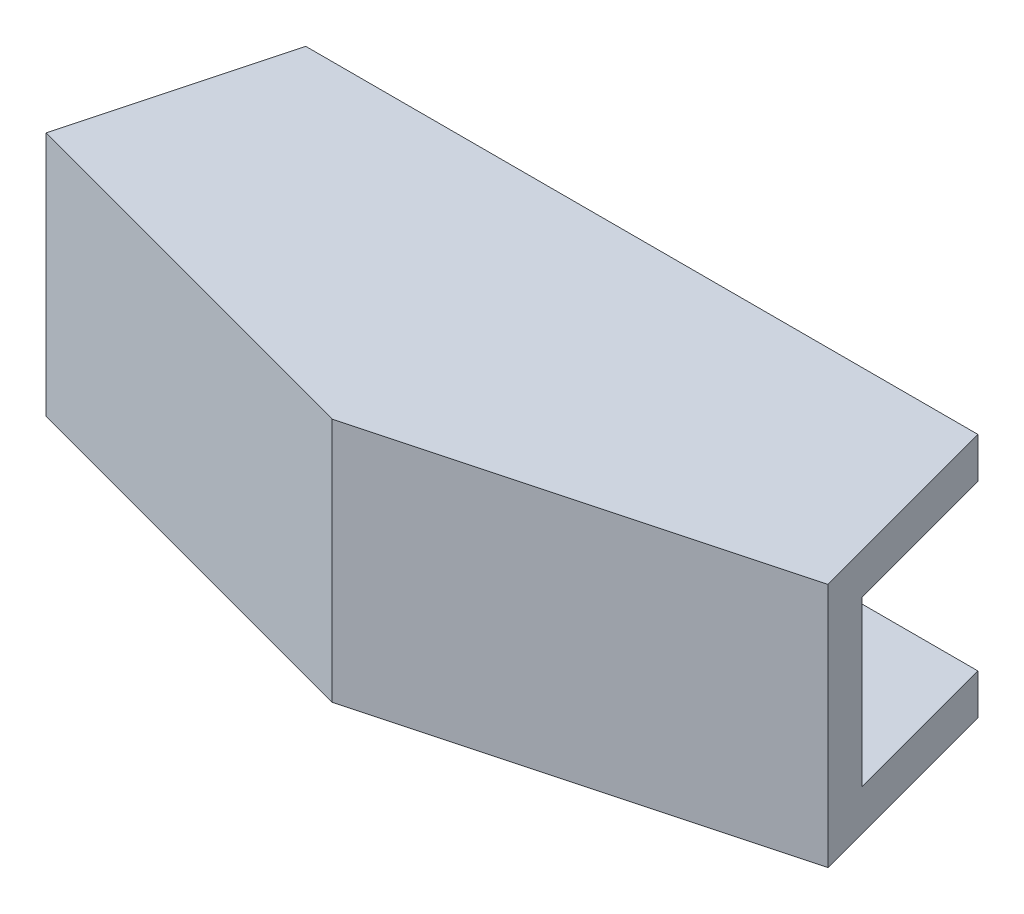
ISO-10303-21;
HEADER;
FILE_DESCRIPTION(('STEP AP214'),'2;1');
FILE_NAME('part.step','',(''),(''),'','','');
FILE_SCHEMA(('AUTOMOTIVE_DESIGN { 1 0 10303 214 1 1 1 1 }'));
ENDSEC;
DATA;
#1=APPLICATION_CONTEXT('core data for automotive mechanical design processes');
#2=APPLICATION_PROTOCOL_DEFINITION('international standard','automotive_design',2000,#1);
#3=PRODUCT_CONTEXT('',#1,'mechanical');
#4=PRODUCT('Part','Part','',(#3));
#5=PRODUCT_RELATED_PRODUCT_CATEGORY('part','',(#4));
#6=PRODUCT_DEFINITION_FORMATION('','',#4);
#7=PRODUCT_DEFINITION_CONTEXT('part definition',#1,'design');
#8=PRODUCT_DEFINITION('design','',#6,#7);
#9=PRODUCT_DEFINITION_SHAPE('','',#8);
#10=(LENGTH_UNIT() NAMED_UNIT(*) SI_UNIT(.MILLI.,.METRE.));
#11=(NAMED_UNIT(*) PLANE_ANGLE_UNIT() SI_UNIT($,.RADIAN.));
#12=(NAMED_UNIT(*) SI_UNIT($,.STERADIAN.) SOLID_ANGLE_UNIT());
#13=UNCERTAINTY_MEASURE_WITH_UNIT(LENGTH_MEASURE(1.E-05),#10,'distance_accuracy_value','');
#14=(GEOMETRIC_REPRESENTATION_CONTEXT(3) GLOBAL_UNCERTAINTY_ASSIGNED_CONTEXT((#13)) GLOBAL_UNIT_ASSIGNED_CONTEXT((#10,
#11,#12)) REPRESENTATION_CONTEXT('',''));
#15=CARTESIAN_POINT('',(0.,0.,0.));
#16=DIRECTION('',(0.,0.,1.));
#17=DIRECTION('',(1.,0.,0.));
#18=AXIS2_PLACEMENT_3D('',#15,#16,#17);
#19=CARTESIAN_POINT('',(-53.4672036631307,5.,37.3612091888934));
#20=DIRECTION('',(0.258819045102508,0.,0.965925826289072));
#21=DIRECTION('',(0.965925826289072,0.,-0.258819045102508));
#22=AXIS2_PLACEMENT_3D('',#19,#20,#21);
#23=PLANE('',#22);
#24=DIRECTION('',(-0.965925826289072,0.,0.258819045102508));
#25=VECTOR('',#24,1.);
#26=CARTESIAN_POINT('',(-11.9506315563798,5.,26.2368772203817));
#27=LINE('',#26,#25);
#28=CARTESIAN_POINT('',(-50.9672036631308,5.,36.6913362078157));
#29=VERTEX_POINT('',#28);
#30=CARTESIAN_POINT('',(-53.4672036631307,5.,37.3612091888934));
#31=VERTEX_POINT('',#30);
#32=EDGE_CURVE('E50',#29,#31,#27,.T.);
#33=ORIENTED_EDGE('',*,*,#32,.T.);
#34=DIRECTION('',(0.,-1.,0.));
#35=VECTOR('',#34,1.);
#36=CARTESIAN_POINT('',(-53.4672036631307,5.,37.3612091888934));
#37=LINE('',#36,#35);
#38=CARTESIAN_POINT('',(-53.4672036631307,25.3,37.3612091888934));
#39=VERTEX_POINT('',#38);
#40=EDGE_CURVE('E238',#39,#31,#37,.T.);
#41=ORIENTED_EDGE('',*,*,#40,.F.);
#42=DIRECTION('',(-0.965925826289072,0.,0.258819045102508));
#43=VECTOR('',#42,1.);
#44=CARTESIAN_POINT('',(-11.9506315563798,25.3,26.2368772203817));
#45=LINE('',#44,#43);
#46=CARTESIAN_POINT('',(-50.9672036631308,25.3,36.6913362078157));
#47=VERTEX_POINT('',#46);
#48=EDGE_CURVE('E166',#47,#39,#45,.T.);
#49=ORIENTED_EDGE('',*,*,#48,.F.);
#50=DIRECTION('',(0.,-1.,0.));
#51=VECTOR('',#50,1.);
#52=CARTESIAN_POINT('',(-50.9672036631308,25.3,36.6913362078157));
#53=LINE('',#52,#51);
#54=EDGE_CURVE('E212',#47,#29,#53,.T.);
#55=ORIENTED_EDGE('',*,*,#54,.T.);
#56=EDGE_LOOP('',(#33,#41,#49,#55));
#57=FACE_BOUND('',#56,.T.);
#58=ADVANCED_FACE('F35',(#57),#23,.F.);
#59=CARTESIAN_POINT('',(-53.4672036631307,5.,37.3612091888934));
#60=DIRECTION('',(-0.258819045102508,0.,0.965925826289072));
#61=DIRECTION('',(0.965925826289072,0.,0.258819045102508));
#62=AXIS2_PLACEMENT_3D('',#59,#60,#61);
#63=PLANE('',#62);
#64=DIRECTION('',(-0.965925826289072,0.,-0.258819045102508));
#65=VECTOR('',#64,1.);
#66=CARTESIAN_POINT('',(-53.4672036631307,5.,37.3612091888934));
#67=LINE('',#66,#65);
#68=CARTESIAN_POINT('',(-55.9672036631307,5.,36.6913362078157));
#69=VERTEX_POINT('',#68);
#70=EDGE_CURVE('E171',#31,#69,#67,.T.);
#71=ORIENTED_EDGE('',*,*,#70,.T.);
#72=DIRECTION('',(0.,-1.,0.));
#73=VECTOR('',#72,1.);
#74=CARTESIAN_POINT('',(-55.9672036631307,25.3,36.6913362078157));
#75=LINE('',#74,#73);
#76=CARTESIAN_POINT('',(-55.9672036631307,25.3,36.6913362078157));
#77=VERTEX_POINT('',#76);
#78=EDGE_CURVE('E209',#77,#69,#75,.T.);
#79=ORIENTED_EDGE('',*,*,#78,.F.);
#80=DIRECTION('',(-0.965925826289072,0.,-0.258819045102508));
#81=VECTOR('',#80,1.);
#82=CARTESIAN_POINT('',(-94.9837757698817,25.3,26.2368772203816));
#83=LINE('',#82,#81);
#84=EDGE_CURVE('E57',#39,#77,#83,.T.);
#85=ORIENTED_EDGE('',*,*,#84,.F.);
#86=ORIENTED_EDGE('',*,*,#40,.T.);
#87=EDGE_LOOP('',(#71,#79,#85,#86));
#88=FACE_BOUND('',#87,.T.);
#89=ADVANCED_FACE('F280',(#88),#63,.F.);
#90=CARTESIAN_POINT('',(0.,5.,0.));
#91=DIRECTION('',(0.,-1.,0.));
#92=DIRECTION('',(0.,0.,-1.));
#93=AXIS2_PLACEMENT_3D('',#90,#91,#92);
#94=PLANE('',#93);
#95=DIRECTION('',(-0.258819045102508,0.,-0.965925826289072));
#96=VECTOR('',#95,1.);
#97=CARTESIAN_POINT('',(-45.7131770475498,5.,56.2996304814838));
#98=LINE('',#97,#96);
#99=CARTESIAN_POINT('',(-45.7131770475498,5.,56.2996304814838));
#100=VERTEX_POINT('',#99);
#101=EDGE_CURVE('E198',#100,#29,#98,.T.);
#102=ORIENTED_EDGE('',*,*,#101,.F.);
#103=DIRECTION('',(-0.965925826289072,0.,0.258819045102508));
#104=VECTOR('',#103,1.);
#105=CARTESIAN_POINT('',(-45.7131770475498,5.,56.2996304814838));
#106=LINE('',#105,#104);
#107=CARTESIAN_POINT('',(-6.69660494079891,5.,45.8451714940498));
#108=VERTEX_POINT('',#107);
#109=EDGE_CURVE('E184',#108,#100,#106,.T.);
#110=ORIENTED_EDGE('',*,*,#109,.F.);
#111=DIRECTION('',(-0.258819045102508,0.,-0.965925826289072));
#112=VECTOR('',#111,1.);
#113=CARTESIAN_POINT('',(-5.17091234867716,5.,51.5391337645799));
#114=LINE('',#113,#112);
#115=CARTESIAN_POINT('',(-11.9506315563798,5.,26.2368772203817));
#116=VERTEX_POINT('',#115);
#117=EDGE_CURVE('E221',#108,#116,#114,.T.);
#118=ORIENTED_EDGE('',*,*,#117,.T.);
#119=DIRECTION('',(1.,0.,0.));
#120=VECTOR('',#119,1.);
#121=CARTESIAN_POINT('',(-94.9837757698817,5.,26.2368772203816));
#122=LINE('',#121,#120);
#123=CARTESIAN_POINT('',(-94.9837757698817,5.,26.2368772203816));
#124=VERTEX_POINT('',#123);
#125=EDGE_CURVE('E259',#124,#116,#122,.T.);
#126=ORIENTED_EDGE('',*,*,#125,.F.);
#127=DIRECTION('',(-0.258819045102508,0.,0.965925826289072));
#128=VECTOR('',#127,1.);
#129=CARTESIAN_POINT('',(-101.763494977584,5.,51.5391337645799));
#130=LINE('',#129,#128);
#131=CARTESIAN_POINT('',(-100.237802385463,5.,45.8451714940498));
#132=VERTEX_POINT('',#131);
#133=EDGE_CURVE('E223',#124,#132,#130,.T.);
#134=ORIENTED_EDGE('',*,*,#133,.T.);
#135=DIRECTION('',(-0.965925826289071,0.,-0.258819045102509));
#136=VECTOR('',#135,1.);
#137=CARTESIAN_POINT('',(-61.2212302787117,5.,56.2996304814838));
#138=LINE('',#137,#136);
#139=CARTESIAN_POINT('',(-61.2212302787117,5.,56.2996304814838));
#140=VERTEX_POINT('',#139);
#141=EDGE_CURVE('E189',#140,#132,#138,.T.);
#142=ORIENTED_EDGE('',*,*,#141,.F.);
#143=DIRECTION('',(-0.258819045102508,0.,0.965925826289072));
#144=VECTOR('',#143,1.);
#145=CARTESIAN_POINT('',(-61.2212302787117,5.,56.2996304814838));
#146=LINE('',#145,#144);
#147=EDGE_CURVE('E200',#69,#140,#146,.T.);
#148=ORIENTED_EDGE('',*,*,#147,.F.);
#149=ORIENTED_EDGE('',*,*,#70,.F.);
#150=ORIENTED_EDGE('',*,*,#32,.F.);
#151=EDGE_LOOP('',(#102,#110,#118,#126,#134,#142,#148,#149,#150));
#152=FACE_BOUND('',#151,.T.);
#153=ADVANCED_FACE('F278',(#152),#94,.F.);
#154=CARTESIAN_POINT('',(-53.4672036631307,5.,64.4800860197053));
#155=DIRECTION('',(0.258819045102508,0.,-0.965925826289072));
#156=DIRECTION('',(-0.965925826289072,0.,-0.258819045102508));
#157=AXIS2_PLACEMENT_3D('',#154,#155,#156);
#158=PLANE('',#157);
#159=DIRECTION('',(0.965925826289072,0.,0.258819045102508));
#160=VECTOR('',#159,1.);
#161=CARTESIAN_POINT('',(-53.4672036631307,0.,64.4800860197053));
#162=LINE('',#161,#160);
#163=CARTESIAN_POINT('',(-101.763494977584,0.,51.5391337645799));
#164=VERTEX_POINT('',#163);
#165=CARTESIAN_POINT('',(-53.4672036631307,0.,64.4800860197053));
#166=VERTEX_POINT('',#165);
#167=EDGE_CURVE('E220',#164,#166,#162,.T.);
#168=ORIENTED_EDGE('',*,*,#167,.T.);
#169=DIRECTION('',(0.,-1.,0.));
#170=VECTOR('',#169,1.);
#171=CARTESIAN_POINT('',(-53.4672036631307,5.,64.4800860197053));
#172=LINE('',#171,#170);
#173=CARTESIAN_POINT('',(-53.4672036631307,30.3,64.4800860197053));
#174=VERTEX_POINT('',#173);
#175=EDGE_CURVE('E11',#174,#166,#172,.T.);
#176=ORIENTED_EDGE('',*,*,#175,.F.);
#177=DIRECTION('',(0.965925826289072,0.,0.258819045102508));
#178=VECTOR('',#177,1.);
#179=CARTESIAN_POINT('',(-101.763494977584,30.3,51.5391337645799));
#180=LINE('',#179,#178);
#181=CARTESIAN_POINT('',(-101.763494977584,30.3,51.5391337645799));
#182=VERTEX_POINT('',#181);
#183=EDGE_CURVE('E161',#182,#174,#180,.T.);
#184=ORIENTED_EDGE('',*,*,#183,.F.);
#185=DIRECTION('',(0.,-1.,0.));
#186=VECTOR('',#185,1.);
#187=CARTESIAN_POINT('',(-101.763494977584,5.,51.5391337645799));
#188=LINE('',#187,#186);
#189=EDGE_CURVE('E226',#182,#164,#188,.T.);
#190=ORIENTED_EDGE('',*,*,#189,.T.);
#191=EDGE_LOOP('',(#168,#176,#184,#190));
#192=FACE_BOUND('',#191,.T.);
#193=ADVANCED_FACE('F37',(#192),#158,.F.);
#194=CARTESIAN_POINT('',(-53.4672036631307,5.,64.4800860197053));
#195=DIRECTION('',(-0.258819045102508,0.,-0.965925826289072));
#196=DIRECTION('',(-0.965925826289072,0.,0.258819045102508));
#197=AXIS2_PLACEMENT_3D('',#194,#195,#196);
#198=PLANE('',#197);
#199=DIRECTION('',(0.965925826289072,0.,-0.258819045102508));
#200=VECTOR('',#199,1.);
#201=CARTESIAN_POINT('',(-53.4672036631307,0.,64.4800860197053));
#202=LINE('',#201,#200);
#203=CARTESIAN_POINT('',(-5.17091234867716,0.,51.5391337645799));
#204=VERTEX_POINT('',#203);
#205=EDGE_CURVE('E229',#166,#204,#202,.T.);
#206=ORIENTED_EDGE('',*,*,#205,.T.);
#207=DIRECTION('',(0.,-1.,0.));
#208=VECTOR('',#207,1.);
#209=CARTESIAN_POINT('',(-5.17091234867716,5.,51.5391337645799));
#210=LINE('',#209,#208);
#211=CARTESIAN_POINT('',(-5.17091234867716,30.3,51.5391337645799));
#212=VERTEX_POINT('',#211);
#213=EDGE_CURVE('E43',#212,#204,#210,.T.);
#214=ORIENTED_EDGE('',*,*,#213,.F.);
#215=DIRECTION('',(0.965925826289072,0.,-0.258819045102508));
#216=VECTOR('',#215,1.);
#217=CARTESIAN_POINT('',(-5.17091234867716,30.3,51.5391337645799));
#218=LINE('',#217,#216);
#219=EDGE_CURVE('E149',#174,#212,#218,.T.);
#220=ORIENTED_EDGE('',*,*,#219,.F.);
#221=ORIENTED_EDGE('',*,*,#175,.T.);
#222=EDGE_LOOP('',(#206,#214,#220,#221));
#223=FACE_BOUND('',#222,.T.);
#224=ADVANCED_FACE('F303',(#223),#198,.F.);
#225=CARTESIAN_POINT('',(-5.17091234867716,5.,51.5391337645799));
#226=DIRECTION('',(-0.965925826289072,0.,0.258819045102508));
#227=DIRECTION('',(0.258819045102508,0.,0.965925826289072));
#228=AXIS2_PLACEMENT_3D('',#225,#226,#227);
#229=PLANE('',#228);
#230=DIRECTION('',(-0.258819045102508,0.,-0.965925826289072));
#231=VECTOR('',#230,1.);
#232=CARTESIAN_POINT('',(-5.17091234867716,0.,51.5391337645799));
#233=LINE('',#232,#231);
#234=CARTESIAN_POINT('',(-11.9506315563798,0.,26.2368772203817));
#235=VERTEX_POINT('',#234);
#236=EDGE_CURVE('E231',#204,#235,#233,.T.);
#237=ORIENTED_EDGE('',*,*,#236,.T.);
#238=DIRECTION('',(0.,-1.,0.));
#239=VECTOR('',#238,1.);
#240=CARTESIAN_POINT('',(-11.9506315563798,5.,26.2368772203817));
#241=LINE('',#240,#239);
#242=EDGE_CURVE('E240',#116,#235,#241,.T.);
#243=ORIENTED_EDGE('',*,*,#242,.F.);
#244=ORIENTED_EDGE('',*,*,#117,.F.);
#245=DIRECTION('',(0.,-1.,0.));
#246=VECTOR('',#245,1.);
#247=CARTESIAN_POINT('',(-6.69660494079891,25.3,45.8451714940498));
#248=LINE('',#247,#246);
#249=CARTESIAN_POINT('',(-6.69660494079891,25.3,45.8451714940498));
#250=VERTEX_POINT('',#249);
#251=EDGE_CURVE('E217',#250,#108,#248,.T.);
#252=ORIENTED_EDGE('',*,*,#251,.F.);
#253=DIRECTION('',(-0.258819045102508,0.,-0.965925826289072));
#254=VECTOR('',#253,1.);
#255=CARTESIAN_POINT('',(-5.17091234867716,25.3,51.5391337645799));
#256=LINE('',#255,#254);
#257=CARTESIAN_POINT('',(-11.9506315563798,25.3,26.2368772203817));
#258=VERTEX_POINT('',#257);
#259=EDGE_CURVE('E150',#250,#258,#256,.T.);
#260=ORIENTED_EDGE('',*,*,#259,.T.);
#261=DIRECTION('',(0.,-1.,0.));
#262=VECTOR('',#261,1.);
#263=CARTESIAN_POINT('',(-11.9506315563798,30.3,26.2368772203817));
#264=LINE('',#263,#262);
#265=CARTESIAN_POINT('',(-11.9506315563798,30.3,26.2368772203817));
#266=VERTEX_POINT('',#265);
#267=EDGE_CURVE('E160',#266,#258,#264,.T.);
#268=ORIENTED_EDGE('',*,*,#267,.F.);
#269=DIRECTION('',(-0.258819045102508,0.,-0.965925826289072));
#270=VECTOR('',#269,1.);
#271=CARTESIAN_POINT('',(-5.17091234867716,30.3,51.5391337645799));
#272=LINE('',#271,#270);
#273=EDGE_CURVE('E177',#212,#266,#272,.T.);
#274=ORIENTED_EDGE('',*,*,#273,.F.);
#275=ORIENTED_EDGE('',*,*,#213,.T.);
#276=EDGE_LOOP('',(#237,#243,#244,#252,#260,#268,#274,#275));
#277=FACE_BOUND('',#276,.T.);
#278=ADVANCED_FACE('F246',(#277),#229,.F.);
#279=CARTESIAN_POINT('',(-101.763494977584,5.,51.5391337645799));
#280=DIRECTION('',(0.965925826289072,0.,0.258819045102508));
#281=DIRECTION('',(0.258819045102508,0.,-0.965925826289072));
#282=AXIS2_PLACEMENT_3D('',#279,#280,#281);
#283=PLANE('',#282);
#284=DIRECTION('',(-0.258819045102508,0.,0.965925826289072));
#285=VECTOR('',#284,1.);
#286=CARTESIAN_POINT('',(-101.763494977584,0.,51.5391337645799));
#287=LINE('',#286,#285);
#288=CARTESIAN_POINT('',(-94.9837757698817,0.,26.2368772203816));
#289=VERTEX_POINT('',#288);
#290=EDGE_CURVE('E224',#289,#164,#287,.T.);
#291=ORIENTED_EDGE('',*,*,#290,.T.);
#292=ORIENTED_EDGE('',*,*,#189,.F.);
#293=DIRECTION('',(-0.258819045102508,0.,0.965925826289072));
#294=VECTOR('',#293,1.);
#295=CARTESIAN_POINT('',(-101.763494977584,30.3,51.5391337645799));
#296=LINE('',#295,#294);
#297=CARTESIAN_POINT('',(-94.9837757698817,30.3,26.2368772203816));
#298=VERTEX_POINT('',#297);
#299=EDGE_CURVE('E156',#298,#182,#296,.T.);
#300=ORIENTED_EDGE('',*,*,#299,.F.);
#301=DIRECTION('',(0.,-1.,0.));
#302=VECTOR('',#301,1.);
#303=CARTESIAN_POINT('',(-94.9837757698817,30.3,26.2368772203816));
#304=LINE('',#303,#302);
#305=CARTESIAN_POINT('',(-94.9837757698817,25.3,26.2368772203816));
#306=VERTEX_POINT('',#305);
#307=EDGE_CURVE('E153',#298,#306,#304,.T.);
#308=ORIENTED_EDGE('',*,*,#307,.T.);
#309=DIRECTION('',(-0.258819045102508,0.,0.965925826289072));
#310=VECTOR('',#309,1.);
#311=CARTESIAN_POINT('',(-101.763494977584,25.3,51.5391337645799));
#312=LINE('',#311,#310);
#313=CARTESIAN_POINT('',(-100.237802385463,25.3,45.8451714940498));
#314=VERTEX_POINT('',#313);
#315=EDGE_CURVE('E138',#306,#314,#312,.T.);
#316=ORIENTED_EDGE('',*,*,#315,.T.);
#317=DIRECTION('',(0.,-1.,0.));
#318=VECTOR('',#317,1.);
#319=CARTESIAN_POINT('',(-100.237802385463,25.3,45.8451714940498));
#320=LINE('',#319,#318);
#321=EDGE_CURVE('E195',#314,#132,#320,.T.);
#322=ORIENTED_EDGE('',*,*,#321,.T.);
#323=ORIENTED_EDGE('',*,*,#133,.F.);
#324=DIRECTION('',(0.,-1.,0.));
#325=VECTOR('',#324,1.);
#326=CARTESIAN_POINT('',(-94.9837757698817,5.,26.2368772203816));
#327=LINE('',#326,#325);
#328=EDGE_CURVE('E236',#124,#289,#327,.T.);
#329=ORIENTED_EDGE('',*,*,#328,.T.);
#330=EDGE_LOOP('',(#291,#292,#300,#308,#316,#322,#323,#329));
#331=FACE_BOUND('',#330,.T.);
#332=ADVANCED_FACE('F154',(#331),#283,.F.);
#333=CARTESIAN_POINT('',(0.,0.,0.));
#334=DIRECTION('',(0.,-1.,0.));
#335=DIRECTION('',(0.,0.,-1.));
#336=AXIS2_PLACEMENT_3D('',#333,#334,#335);
#337=PLANE('',#336);
#338=ORIENTED_EDGE('',*,*,#290,.F.);
#339=DIRECTION('',(1.,0.,0.));
#340=VECTOR('',#339,1.);
#341=CARTESIAN_POINT('',(-94.9837757698817,0.,26.2368772203816));
#342=LINE('',#341,#340);
#343=EDGE_CURVE('E256',#289,#235,#342,.T.);
#344=ORIENTED_EDGE('',*,*,#343,.T.);
#345=ORIENTED_EDGE('',*,*,#236,.F.);
#346=ORIENTED_EDGE('',*,*,#205,.F.);
#347=ORIENTED_EDGE('',*,*,#167,.F.);
#348=EDGE_LOOP('',(#338,#344,#345,#346,#347));
#349=FACE_BOUND('',#348,.T.);
#350=ADVANCED_FACE('F253',(#349),#337,.T.);
#351=CARTESIAN_POINT('',(-45.7131770475498,25.3,56.2996304814838));
#352=DIRECTION('',(0.258819045102508,0.,0.965925826289071));
#353=DIRECTION('',(0.965925826289072,0.,-0.258819045102508));
#354=AXIS2_PLACEMENT_3D('',#351,#352,#353);
#355=PLANE('',#354);
#356=ORIENTED_EDGE('',*,*,#109,.T.);
#357=DIRECTION('',(0.,-1.,0.));
#358=VECTOR('',#357,1.);
#359=CARTESIAN_POINT('',(-45.7131770475498,25.3,56.2996304814838));
#360=LINE('',#359,#358);
#361=CARTESIAN_POINT('',(-45.7131770475498,25.3,56.2996304814838));
#362=VERTEX_POINT('',#361);
#363=EDGE_CURVE('E214',#362,#100,#360,.T.);
#364=ORIENTED_EDGE('',*,*,#363,.F.);
#365=DIRECTION('',(-0.965925826289072,0.,0.258819045102508));
#366=VECTOR('',#365,1.);
#367=CARTESIAN_POINT('',(-45.7131770475498,25.3,56.2996304814838));
#368=LINE('',#367,#366);
#369=EDGE_CURVE('E185',#250,#362,#368,.T.);
#370=ORIENTED_EDGE('',*,*,#369,.F.);
#371=ORIENTED_EDGE('',*,*,#251,.T.);
#372=EDGE_LOOP('',(#356,#364,#370,#371));
#373=FACE_BOUND('',#372,.T.);
#374=ADVANCED_FACE('F272',(#373),#355,.F.);
#375=CARTESIAN_POINT('',(-45.7131770475498,25.3,56.2996304814838));
#376=DIRECTION('',(-0.965925826289072,0.,0.258819045102508));
#377=DIRECTION('',(0.258819045102508,0.,0.965925826289072));
#378=AXIS2_PLACEMENT_3D('',#375,#376,#377);
#379=PLANE('',#378);
#380=ORIENTED_EDGE('',*,*,#101,.T.);
#381=ORIENTED_EDGE('',*,*,#54,.F.);
#382=DIRECTION('',(-0.258819045102508,0.,-0.965925826289072));
#383=VECTOR('',#382,1.);
#384=CARTESIAN_POINT('',(-45.7131770475498,25.3,56.2996304814838));
#385=LINE('',#384,#383);
#386=EDGE_CURVE('E188',#362,#47,#385,.T.);
#387=ORIENTED_EDGE('',*,*,#386,.F.);
#388=ORIENTED_EDGE('',*,*,#363,.T.);
#389=EDGE_LOOP('',(#380,#381,#387,#388));
#390=FACE_BOUND('',#389,.T.);
#391=ADVANCED_FACE('F275',(#390),#379,.F.);
#392=CARTESIAN_POINT('',(-61.2212302787117,25.3,56.2996304814838));
#393=DIRECTION('',(0.965925826289072,0.,0.258819045102508));
#394=DIRECTION('',(0.258819045102508,0.,-0.965925826289072));
#395=AXIS2_PLACEMENT_3D('',#392,#393,#394);
#396=PLANE('',#395);
#397=ORIENTED_EDGE('',*,*,#147,.T.);
#398=DIRECTION('',(0.,-1.,0.));
#399=VECTOR('',#398,1.);
#400=CARTESIAN_POINT('',(-61.2212302787117,25.3,56.2996304814838));
#401=LINE('',#400,#399);
#402=CARTESIAN_POINT('',(-61.2212302787117,25.3,56.2996304814838));
#403=VERTEX_POINT('',#402);
#404=EDGE_CURVE('E206',#403,#140,#401,.T.);
#405=ORIENTED_EDGE('',*,*,#404,.F.);
#406=DIRECTION('',(-0.258819045102508,0.,0.965925826289072));
#407=VECTOR('',#406,1.);
#408=CARTESIAN_POINT('',(-61.2212302787117,25.3,56.2996304814838));
#409=LINE('',#408,#407);
#410=EDGE_CURVE('E192',#77,#403,#409,.T.);
#411=ORIENTED_EDGE('',*,*,#410,.F.);
#412=ORIENTED_EDGE('',*,*,#78,.T.);
#413=EDGE_LOOP('',(#397,#405,#411,#412));
#414=FACE_BOUND('',#413,.T.);
#415=ADVANCED_FACE('F283',(#414),#396,.F.);
#416=CARTESIAN_POINT('',(-61.2212302787117,25.3,56.2996304814838));
#417=DIRECTION('',(-0.258819045102509,0.,0.965925826289072));
#418=DIRECTION('',(0.965925826289072,0.,0.258819045102509));
#419=AXIS2_PLACEMENT_3D('',#416,#417,#418);
#420=PLANE('',#419);
#421=ORIENTED_EDGE('',*,*,#141,.T.);
#422=ORIENTED_EDGE('',*,*,#321,.F.);
#423=DIRECTION('',(-0.965925826289071,0.,-0.258819045102509));
#424=VECTOR('',#423,1.);
#425=CARTESIAN_POINT('',(-61.2212302787117,25.3,56.2996304814838));
#426=LINE('',#425,#424);
#427=EDGE_CURVE('E146',#403,#314,#426,.T.);
#428=ORIENTED_EDGE('',*,*,#427,.F.);
#429=ORIENTED_EDGE('',*,*,#404,.T.);
#430=EDGE_LOOP('',(#421,#422,#428,#429));
#431=FACE_BOUND('',#430,.T.);
#432=ADVANCED_FACE('F285',(#431),#420,.F.);
#433=CARTESIAN_POINT('',(0.,25.3,0.));
#434=DIRECTION('',(0.,-1.,0.));
#435=DIRECTION('',(0.,0.,-1.));
#436=AXIS2_PLACEMENT_3D('',#433,#434,#435);
#437=PLANE('',#436);
#438=ORIENTED_EDGE('',*,*,#259,.F.);
#439=ORIENTED_EDGE('',*,*,#369,.T.);
#440=ORIENTED_EDGE('',*,*,#386,.T.);
#441=ORIENTED_EDGE('',*,*,#48,.T.);
#442=ORIENTED_EDGE('',*,*,#84,.T.);
#443=ORIENTED_EDGE('',*,*,#410,.T.);
#444=ORIENTED_EDGE('',*,*,#427,.T.);
#445=ORIENTED_EDGE('',*,*,#315,.F.);
#446=DIRECTION('',(1.,0.,0.));
#447=VECTOR('',#446,1.);
#448=CARTESIAN_POINT('',(-94.9837757698817,25.3,26.2368772203816));
#449=LINE('',#448,#447);
#450=EDGE_CURVE('E143',#306,#258,#449,.T.);
#451=ORIENTED_EDGE('',*,*,#450,.T.);
#452=EDGE_LOOP('',(#438,#439,#440,#441,#442,#443,#444,#445,#451));
#453=FACE_BOUND('',#452,.T.);
#454=ADVANCED_FACE('F141',(#453),#437,.T.);
#455=CARTESIAN_POINT('',(0.,30.3,0.));
#456=DIRECTION('',(0.,-1.,0.));
#457=DIRECTION('',(0.,0.,-1.));
#458=AXIS2_PLACEMENT_3D('',#455,#456,#457);
#459=PLANE('',#458);
#460=DIRECTION('',(1.,0.,0.));
#461=VECTOR('',#460,1.);
#462=CARTESIAN_POINT('',(-94.9837757698817,30.3,26.2368772203816));
#463=LINE('',#462,#461);
#464=EDGE_CURVE('E169',#298,#266,#463,.T.);
#465=ORIENTED_EDGE('',*,*,#464,.F.);
#466=ORIENTED_EDGE('',*,*,#299,.T.);
#467=ORIENTED_EDGE('',*,*,#183,.T.);
#468=ORIENTED_EDGE('',*,*,#219,.T.);
#469=ORIENTED_EDGE('',*,*,#273,.T.);
#470=EDGE_LOOP('',(#465,#466,#467,#468,#469));
#471=FACE_BOUND('',#470,.T.);
#472=ADVANCED_FACE('F266',(#471),#459,.F.);
#473=CARTESIAN_POINT('',(-94.9837757698817,30.3,26.2368772203816));
#474=DIRECTION('',(0.,0.,-1.));
#475=DIRECTION('',(-1.,0.,0.));
#476=AXIS2_PLACEMENT_3D('',#473,#474,#475);
#477=PLANE('',#476);
#478=ORIENTED_EDGE('',*,*,#450,.F.);
#479=ORIENTED_EDGE('',*,*,#307,.F.);
#480=ORIENTED_EDGE('',*,*,#464,.T.);
#481=ORIENTED_EDGE('',*,*,#267,.T.);
#482=EDGE_LOOP('',(#478,#479,#480,#481));
#483=FACE_BOUND('',#482,.T.);
#484=ADVANCED_FACE('F164',(#483),#477,.T.);
#485=CARTESIAN_POINT('',(-94.9837757698817,5.,26.2368772203816));
#486=DIRECTION('',(0.,0.,-1.));
#487=DIRECTION('',(-1.,0.,0.));
#488=AXIS2_PLACEMENT_3D('',#485,#486,#487);
#489=PLANE('',#488);
#490=ORIENTED_EDGE('',*,*,#343,.F.);
#491=ORIENTED_EDGE('',*,*,#328,.F.);
#492=ORIENTED_EDGE('',*,*,#125,.T.);
#493=ORIENTED_EDGE('',*,*,#242,.T.);
#494=EDGE_LOOP('',(#490,#491,#492,#493));
#495=FACE_BOUND('',#494,.T.);
#496=ADVANCED_FACE('F287',(#495),#489,.T.);
#497=CLOSED_SHELL('',(#58,#89,#153,#193,#224,#278,#332,#350,#374,#391,#415,#432,#454,#472,#484,#496));
#498=MANIFOLD_SOLID_BREP('B2',#497);
#499=ADVANCED_BREP_SHAPE_REPRESENTATION('',(#18,#498),#14);
#500=SHAPE_DEFINITION_REPRESENTATION(#9,#499);
ENDSEC;
END-ISO-10303-21;
